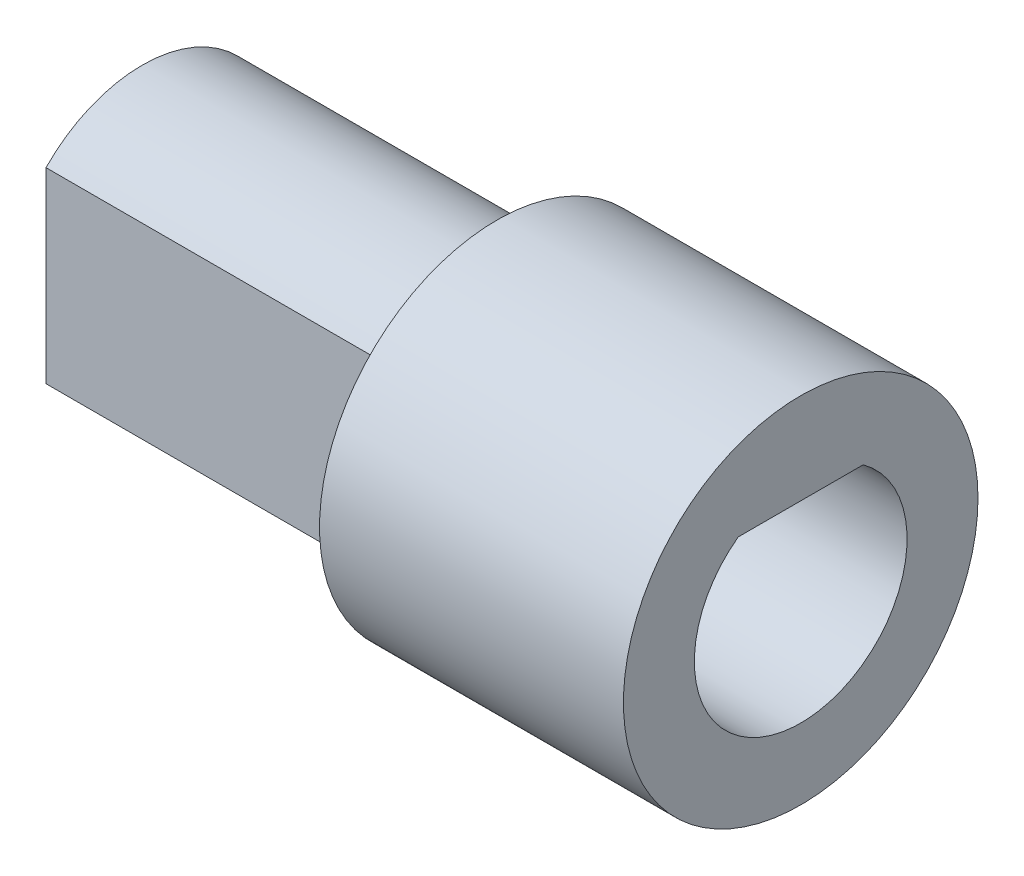
ISO-10303-21;
HEADER;
FILE_DESCRIPTION(('STEP AP214'),'2;1');
FILE_NAME('part.step','',(''),(''),'','','');
FILE_SCHEMA(('AUTOMOTIVE_DESIGN { 1 0 10303 214 1 1 1 1 }'));
ENDSEC;
DATA;
#1=APPLICATION_CONTEXT('core data for automotive mechanical design processes');
#2=APPLICATION_PROTOCOL_DEFINITION('international standard','automotive_design',2000,#1);
#3=PRODUCT_CONTEXT('',#1,'mechanical');
#4=PRODUCT('Part','Part','',(#3));
#5=PRODUCT_RELATED_PRODUCT_CATEGORY('part','',(#4));
#6=PRODUCT_DEFINITION_FORMATION('','',#4);
#7=PRODUCT_DEFINITION_CONTEXT('part definition',#1,'design');
#8=PRODUCT_DEFINITION('design','',#6,#7);
#9=PRODUCT_DEFINITION_SHAPE('','',#8);
#10=(LENGTH_UNIT() NAMED_UNIT(*) SI_UNIT(.MILLI.,.METRE.));
#11=(NAMED_UNIT(*) PLANE_ANGLE_UNIT() SI_UNIT($,.RADIAN.));
#12=(NAMED_UNIT(*) SI_UNIT($,.STERADIAN.) SOLID_ANGLE_UNIT());
#13=UNCERTAINTY_MEASURE_WITH_UNIT(LENGTH_MEASURE(1.E-05),#10,'distance_accuracy_value','');
#14=(GEOMETRIC_REPRESENTATION_CONTEXT(3) GLOBAL_UNCERTAINTY_ASSIGNED_CONTEXT((#13)) GLOBAL_UNIT_ASSIGNED_CONTEXT((#10,
#11,#12)) REPRESENTATION_CONTEXT('',''));
#15=CARTESIAN_POINT('',(0.,0.,0.));
#16=DIRECTION('',(0.,0.,1.));
#17=DIRECTION('',(1.,0.,0.));
#18=AXIS2_PLACEMENT_3D('',#15,#16,#17);
#19=CARTESIAN_POINT('',(-7.,0.,0.));
#20=DIRECTION('',(1.,0.,0.));
#21=DIRECTION('',(0.,0.,-1.));
#22=AXIS2_PLACEMENT_3D('',#19,#20,#21);
#23=CYLINDRICAL_SURFACE('',#22,2.65);
#24=DIRECTION('',(1.,0.,0.));
#25=VECTOR('',#24,1.);
#26=CARTESIAN_POINT('',(-7.,1.84729532019112,1.9));
#27=LINE('',#26,#25);
#28=CARTESIAN_POINT('',(-7.,1.84729532019112,1.9));
#29=VERTEX_POINT('',#28);
#30=CARTESIAN_POINT('',(-0.5,1.84729532019112,1.9));
#31=VERTEX_POINT('',#30);
#32=EDGE_CURVE('E143',#29,#31,#27,.T.);
#33=ORIENTED_EDGE('',*,*,#32,.T.);
#34=CARTESIAN_POINT('',(-0.5,0.,0.));
#35=DIRECTION('',(1.,0.,0.));
#36=DIRECTION('',(0.,0.,-1.));
#37=AXIS2_PLACEMENT_3D('',#34,#35,#36);
#38=CIRCLE('',#37,2.65);
#39=CARTESIAN_POINT('',(-0.5,1.84729532019112,-1.9));
#40=VERTEX_POINT('',#39);
#41=EDGE_CURVE('E11',#31,#40,#38,.F.);
#42=ORIENTED_EDGE('',*,*,#41,.T.);
#43=DIRECTION('',(1.,0.,0.));
#44=VECTOR('',#43,1.);
#45=CARTESIAN_POINT('',(-7.,1.84729532019112,-1.9));
#46=LINE('',#45,#44);
#47=CARTESIAN_POINT('',(-7.,1.84729532019112,-1.9));
#48=VERTEX_POINT('',#47);
#49=EDGE_CURVE('E144',#48,#40,#46,.T.);
#50=ORIENTED_EDGE('',*,*,#49,.F.);
#51=CARTESIAN_POINT('',(-7.,0.,0.));
#52=DIRECTION('',(1.,0.,0.));
#53=DIRECTION('',(0.,0.,-1.));
#54=AXIS2_PLACEMENT_3D('',#51,#52,#53);
#55=CIRCLE('',#54,2.65);
#56=EDGE_CURVE('E128',#48,#29,#55,.T.);
#57=ORIENTED_EDGE('',*,*,#56,.T.);
#58=EDGE_LOOP('',(#33,#42,#50,#57));
#59=FACE_BOUND('',#58,.T.);
#60=ADVANCED_FACE('F33',(#59),#23,.T.);
#61=CARTESIAN_POINT('',(-7.,1.84729532019112,-1.9));
#62=DIRECTION('',(0.,0.,-1.));
#63=DIRECTION('',(-1.,0.,0.));
#64=AXIS2_PLACEMENT_3D('',#61,#62,#63);
#65=PLANE('',#64);
#66=ORIENTED_EDGE('',*,*,#49,.T.);
#67=DIRECTION('',(0.,1.,0.));
#68=VECTOR('',#67,1.);
#69=CARTESIAN_POINT('',(-0.5,1.84729532019112,-1.9));
#70=LINE('',#69,#68);
#71=CARTESIAN_POINT('',(-0.5,-1.84729532019112,-1.9));
#72=VERTEX_POINT('',#71);
#73=EDGE_CURVE('E162',#40,#72,#70,.F.);
#74=ORIENTED_EDGE('',*,*,#73,.T.);
#75=DIRECTION('',(1.,0.,0.));
#76=VECTOR('',#75,1.);
#77=CARTESIAN_POINT('',(-7.,-1.84729532019112,-1.9));
#78=LINE('',#77,#76);
#79=CARTESIAN_POINT('',(-7.,-1.84729532019112,-1.9));
#80=VERTEX_POINT('',#79);
#81=EDGE_CURVE('E148',#80,#72,#78,.T.);
#82=ORIENTED_EDGE('',*,*,#81,.F.);
#83=DIRECTION('',(0.,1.,0.));
#84=VECTOR('',#83,1.);
#85=CARTESIAN_POINT('',(-7.,1.84729532019112,-1.9));
#86=LINE('',#85,#84);
#87=EDGE_CURVE('E140',#80,#48,#86,.T.);
#88=ORIENTED_EDGE('',*,*,#87,.T.);
#89=EDGE_LOOP('',(#66,#74,#82,#88));
#90=FACE_BOUND('',#89,.T.);
#91=ADVANCED_FACE('F211',(#90),#65,.T.);
#92=CARTESIAN_POINT('',(-7.,0.,0.));
#93=DIRECTION('',(1.,0.,0.));
#94=DIRECTION('',(0.,0.,-1.));
#95=AXIS2_PLACEMENT_3D('',#92,#93,#94);
#96=CYLINDRICAL_SURFACE('',#95,2.65);
#97=ORIENTED_EDGE('',*,*,#81,.T.);
#98=CARTESIAN_POINT('',(-0.5,0.,0.));
#99=DIRECTION('',(1.,0.,0.));
#100=DIRECTION('',(0.,0.,-1.));
#101=AXIS2_PLACEMENT_3D('',#98,#99,#100);
#102=CIRCLE('',#101,2.65);
#103=CARTESIAN_POINT('',(-0.5,-1.84729532019112,1.9));
#104=VERTEX_POINT('',#103);
#105=EDGE_CURVE('E165',#72,#104,#102,.F.);
#106=ORIENTED_EDGE('',*,*,#105,.T.);
#107=DIRECTION('',(1.,0.,0.));
#108=VECTOR('',#107,1.);
#109=CARTESIAN_POINT('',(-7.,-1.84729532019112,1.9));
#110=LINE('',#109,#108);
#111=CARTESIAN_POINT('',(-7.,-1.84729532019112,1.9));
#112=VERTEX_POINT('',#111);
#113=EDGE_CURVE('E151',#112,#104,#110,.T.);
#114=ORIENTED_EDGE('',*,*,#113,.F.);
#115=CARTESIAN_POINT('',(-7.,0.,0.));
#116=DIRECTION('',(1.,0.,0.));
#117=DIRECTION('',(0.,0.,-1.));
#118=AXIS2_PLACEMENT_3D('',#115,#116,#117);
#119=CIRCLE('',#118,2.65);
#120=EDGE_CURVE('E137',#112,#80,#119,.T.);
#121=ORIENTED_EDGE('',*,*,#120,.T.);
#122=EDGE_LOOP('',(#97,#106,#114,#121));
#123=FACE_BOUND('',#122,.T.);
#124=ADVANCED_FACE('F212',(#123),#96,.T.);
#125=CARTESIAN_POINT('',(-7.,1.84729532019112,1.9));
#126=DIRECTION('',(0.,0.,1.));
#127=DIRECTION('',(1.,0.,0.));
#128=AXIS2_PLACEMENT_3D('',#125,#126,#127);
#129=PLANE('',#128);
#130=ORIENTED_EDGE('',*,*,#113,.T.);
#131=DIRECTION('',(0.,-1.,0.));
#132=VECTOR('',#131,1.);
#133=CARTESIAN_POINT('',(-0.5,1.84729532019112,1.9));
#134=LINE('',#133,#132);
#135=EDGE_CURVE('E47',#104,#31,#134,.F.);
#136=ORIENTED_EDGE('',*,*,#135,.T.);
#137=ORIENTED_EDGE('',*,*,#32,.F.);
#138=DIRECTION('',(0.,-1.,0.));
#139=VECTOR('',#138,1.);
#140=CARTESIAN_POINT('',(-7.,1.84729532019112,1.9));
#141=LINE('',#140,#139);
#142=EDGE_CURVE('E134',#29,#112,#141,.T.);
#143=ORIENTED_EDGE('',*,*,#142,.T.);
#144=EDGE_LOOP('',(#130,#136,#137,#143));
#145=FACE_BOUND('',#144,.T.);
#146=ADVANCED_FACE('F240',(#145),#129,.T.);
#147=CARTESIAN_POINT('',(-7.,0.,0.));
#148=DIRECTION('',(1.,0.,0.));
#149=DIRECTION('',(0.,0.,-1.));
#150=AXIS2_PLACEMENT_3D('',#147,#148,#149);
#151=PLANE('',#150);
#152=ORIENTED_EDGE('',*,*,#56,.F.);
#153=ORIENTED_EDGE('',*,*,#87,.F.);
#154=ORIENTED_EDGE('',*,*,#120,.F.);
#155=ORIENTED_EDGE('',*,*,#142,.F.);
#156=EDGE_LOOP('',(#152,#153,#154,#155));
#157=FACE_BOUND('',#156,.T.);
#158=ADVANCED_FACE('F218',(#157),#151,.F.);
#159=CARTESIAN_POINT('',(0.,0.,0.));
#160=DIRECTION('',(1.,0.,0.));
#161=DIRECTION('',(0.,0.,-1.));
#162=AXIS2_PLACEMENT_3D('',#159,#160,#161);
#163=PLANE('',#162);
#164=CARTESIAN_POINT('',(0.,0.,0.));
#165=DIRECTION('',(1.,0.,0.));
#166=DIRECTION('',(0.,0.,-1.));
#167=AXIS2_PLACEMENT_3D('',#164,#165,#166);
#168=CIRCLE('',#167,3.15);
#169=CARTESIAN_POINT('',(0.,-2.04022057631032,2.4));
#170=VERTEX_POINT('',#169);
#171=CARTESIAN_POINT('',(0.,-2.04022057631032,-2.4));
#172=VERTEX_POINT('',#171);
#173=EDGE_CURVE('E157',#170,#172,#168,.T.);
#174=ORIENTED_EDGE('',*,*,#173,.T.);
#175=DIRECTION('',(0.,1.,0.));
#176=VECTOR('',#175,1.);
#177=CARTESIAN_POINT('',(0.,0.,-2.4));
#178=LINE('',#177,#176);
#179=CARTESIAN_POINT('',(0.,2.04022057631032,-2.4));
#180=VERTEX_POINT('',#179);
#181=EDGE_CURVE('E159',#172,#180,#178,.T.);
#182=ORIENTED_EDGE('',*,*,#181,.T.);
#183=CARTESIAN_POINT('',(0.,0.,0.));
#184=DIRECTION('',(1.,0.,0.));
#185=DIRECTION('',(0.,0.,-1.));
#186=AXIS2_PLACEMENT_3D('',#183,#184,#185);
#187=CIRCLE('',#186,3.15);
#188=CARTESIAN_POINT('',(0.,2.04022057631032,2.4));
#189=VERTEX_POINT('',#188);
#190=EDGE_CURVE('E147',#180,#189,#187,.T.);
#191=ORIENTED_EDGE('',*,*,#190,.T.);
#192=DIRECTION('',(0.,-1.,0.));
#193=VECTOR('',#192,1.);
#194=CARTESIAN_POINT('',(0.,0.,2.4));
#195=LINE('',#194,#193);
#196=EDGE_CURVE('E155',#189,#170,#195,.T.);
#197=ORIENTED_EDGE('',*,*,#196,.T.);
#198=EDGE_LOOP('',(#174,#182,#191,#197));
#199=FACE_BOUND('',#198,.T.);
#200=CARTESIAN_POINT('',(0.,0.,0.));
#201=DIRECTION('',(1.,0.,0.));
#202=DIRECTION('',(0.,0.,-1.));
#203=AXIS2_PLACEMENT_3D('',#200,#201,#202);
#204=CIRCLE('',#203,3.5);
#205=CARTESIAN_POINT('',(0.,0.,-3.5));
#206=VERTEX_POINT('',#205);
#207=EDGE_CURVE('E129',#206,#206,#204,.T.);
#208=ORIENTED_EDGE('',*,*,#207,.F.);
#209=EDGE_LOOP('',(#208));
#210=FACE_BOUND('',#209,.T.);
#211=ADVANCED_FACE('F222',(#199,#210),#163,.F.);
#212=CARTESIAN_POINT('',(6.,0.,0.));
#213=DIRECTION('',(-1.,0.,0.));
#214=DIRECTION('',(0.,0.,1.));
#215=AXIS2_PLACEMENT_3D('',#212,#213,#214);
#216=CYLINDRICAL_SURFACE('',#215,3.5);
#217=CARTESIAN_POINT('',(6.,0.,0.));
#218=DIRECTION('',(1.,0.,0.));
#219=DIRECTION('',(0.,0.,-1.));
#220=AXIS2_PLACEMENT_3D('',#217,#218,#219);
#221=CIRCLE('',#220,3.5);
#222=CARTESIAN_POINT('',(6.,0.,-3.5));
#223=VERTEX_POINT('',#222);
#224=EDGE_CURVE('E125',#223,#223,#221,.T.);
#225=ORIENTED_EDGE('',*,*,#224,.F.);
#226=EDGE_LOOP('',(#225));
#227=FACE_BOUND('',#226,.T.);
#228=ORIENTED_EDGE('',*,*,#207,.T.);
#229=EDGE_LOOP('',(#228));
#230=FACE_BOUND('',#229,.T.);
#231=ADVANCED_FACE('F231',(#227,#230),#216,.T.);
#232=CARTESIAN_POINT('',(6.,0.,0.));
#233=DIRECTION('',(1.,0.,0.));
#234=DIRECTION('',(0.,0.,-1.));
#235=AXIS2_PLACEMENT_3D('',#232,#233,#234);
#236=PLANE('',#235);
#237=CARTESIAN_POINT('',(6.,0.,0.));
#238=DIRECTION('',(1.,0.,0.));
#239=DIRECTION('',(0.,0.,-1.));
#240=AXIS2_PLACEMENT_3D('',#237,#238,#239);
#241=CIRCLE('',#240,2.1);
#242=CARTESIAN_POINT('',(6.,1.7,1.2328828005938));
#243=VERTEX_POINT('',#242);
#244=CARTESIAN_POINT('',(6.,1.7,-1.2328828005938));
#245=VERTEX_POINT('',#244);
#246=EDGE_CURVE('E55',#243,#245,#241,.T.);
#247=ORIENTED_EDGE('',*,*,#246,.F.);
#248=DIRECTION('',(0.,0.,1.));
#249=VECTOR('',#248,1.);
#250=CARTESIAN_POINT('',(6.,1.7,1.2328828005938));
#251=LINE('',#250,#249);
#252=EDGE_CURVE('E116',#245,#243,#251,.T.);
#253=ORIENTED_EDGE('',*,*,#252,.F.);
#254=EDGE_LOOP('',(#247,#253));
#255=FACE_BOUND('',#254,.T.);
#256=ORIENTED_EDGE('',*,*,#224,.T.);
#257=EDGE_LOOP('',(#256));
#258=FACE_BOUND('',#257,.T.);
#259=ADVANCED_FACE('F226',(#255,#258),#236,.T.);
#260=CARTESIAN_POINT('',(-0.5,0.,2.4));
#261=DIRECTION('',(0.,-1.,0.));
#262=DIRECTION('',(0.,0.,-1.));
#263=AXIS2_PLACEMENT_3D('',#260,#261,#262);
#264=CYLINDRICAL_SURFACE('',#263,0.5);
#265=CARTESIAN_POINT('',(-0.5,1.84729532019112,1.9));
#266=CARTESIAN_POINT('',(-0.473313299022205,1.84728099192078,1.89997037218295));
#267=CARTESIAN_POINT('',(-0.446646865629517,1.84816191215664,1.9021344661516));
#268=CARTESIAN_POINT('',(-0.394169339908651,1.85160200274379,1.91061654198202));
#269=CARTESIAN_POINT('',(-0.36835602889857,1.85415638877057,1.91692268214877));
#270=CARTESIAN_POINT('',(-0.318246984437916,1.86083128190166,1.93345511544516));
#271=CARTESIAN_POINT('',(-0.293950783441736,1.86495130370436,1.9436801938262));
#272=CARTESIAN_POINT('',(-0.247467436875275,1.8745731808725,1.96766759561641));
#273=CARTESIAN_POINT('',(-0.225281143808752,1.8800755915466,1.98143134056773));
#274=CARTESIAN_POINT('',(-0.182846848627034,1.89244383561732,2.01253625988208));
#275=CARTESIAN_POINT('',(-0.162683884474139,1.89934775247858,2.02997805365335));
#276=CARTESIAN_POINT('',(-0.125542800850984,1.91415093797732,2.06761270037761));
#277=CARTESIAN_POINT('',(-0.108565794348544,1.92205055284239,2.08780651047061));
#278=CARTESIAN_POINT('',(-0.0770523696468303,1.93916734983726,2.13186128372807));
#279=CARTESIAN_POINT('',(-0.0627640663230558,1.94843778064198,2.1558789315621));
#280=CARTESIAN_POINT('',(-0.0384323189516263,1.96754809981078,2.2057695404265));
#281=CARTESIAN_POINT('',(-0.0283895659525638,1.97738808058444,2.23164280269435));
#282=CARTESIAN_POINT('',(-0.0139796544551096,1.99576003930094,2.28032503712598));
#283=CARTESIAN_POINT('',(-0.00896115666311815,2.00424914064896,2.30296122192505));
#284=CARTESIAN_POINT('',(-0.00210851708425217,2.02127667251313,2.34865813525806));
#285=CARTESIAN_POINT('',(-0.000268088516354063,2.02981497203937,2.37171793422004));
#286=CARTESIAN_POINT('',(-9.04590209242298E-06,2.03894214138096,2.39652309187162));
#287=CARTESIAN_POINT('',(2.34085730246771E-08,2.03958152104385,2.39826157490041));
#288=CARTESIAN_POINT('',(0.,2.04022057631032,2.4));
#289=B_SPLINE_CURVE_WITH_KNOTS('',3,(#265,#266,#267,#268,#269,#270,#271,#272,#273,#274,#275,
#276,#277,#278,#279,#280,#281,#282,#283,#284,#285,#286,#287,#288),.UNSPECIFIED.,.F.,.F.,(4,2,2,
2,2,2,2,2,2,2,2,4),(0.,0.0799265424749896,0.159625571774669,0.239299916814884,0.319006318532275,
0.401270296432231,0.483562958773993,0.571514646980536,0.65948064558405,0.733359977388135,
0.807092994714623,0.812649950240695),.UNSPECIFIED.);
#290=EDGE_CURVE('E190',#31,#189,#289,.T.);
#291=ORIENTED_EDGE('',*,*,#290,.F.);
#292=ORIENTED_EDGE('',*,*,#135,.F.);
#293=CARTESIAN_POINT('',(-0.5,-1.84729532019112,1.9));
#294=CARTESIAN_POINT('',(-0.473313299022205,-1.84728099192078,1.89997037218295));
#295=CARTESIAN_POINT('',(-0.446646865629517,-1.84816191215664,1.9021344661516));
#296=CARTESIAN_POINT('',(-0.394169339908651,-1.85160200274379,1.91061654198202));
#297=CARTESIAN_POINT('',(-0.36835602889857,-1.85415638877057,1.91692268214877));
#298=CARTESIAN_POINT('',(-0.318246984437916,-1.86083128190166,1.93345511544516));
#299=CARTESIAN_POINT('',(-0.293950783441736,-1.86495130370436,1.9436801938262));
#300=CARTESIAN_POINT('',(-0.247467436875275,-1.8745731808725,1.96766759561641));
#301=CARTESIAN_POINT('',(-0.225281143808752,-1.8800755915466,1.98143134056773));
#302=CARTESIAN_POINT('',(-0.182846848627034,-1.89244383561732,2.01253625988208));
#303=CARTESIAN_POINT('',(-0.162683884474139,-1.89934775247858,2.02997805365335));
#304=CARTESIAN_POINT('',(-0.125542800850984,-1.91415093797732,2.06761270037761));
#305=CARTESIAN_POINT('',(-0.108565794348544,-1.92205055284239,2.08780651047061));
#306=CARTESIAN_POINT('',(-0.0770523696468303,-1.93916734983726,2.13186128372807));
#307=CARTESIAN_POINT('',(-0.0627640663230558,-1.94843778064198,2.1558789315621));
#308=CARTESIAN_POINT('',(-0.0384323189516263,-1.96754809981078,2.2057695404265));
#309=CARTESIAN_POINT('',(-0.0283895659525638,-1.97738808058444,2.23164280269435));
#310=CARTESIAN_POINT('',(-0.0139796544551096,-1.99576003930094,2.28032503712598));
#311=CARTESIAN_POINT('',(-0.00896115666311815,-2.00424914064896,2.30296122192505));
#312=CARTESIAN_POINT('',(-0.00210851708425217,-2.02127667251313,2.34865813525806));
#313=CARTESIAN_POINT('',(-0.000268088516354063,-2.02981497203937,2.37171793422004));
#314=CARTESIAN_POINT('',(-9.04590209242298E-06,-2.03894214138096,2.39652309187162));
#315=CARTESIAN_POINT('',(2.34085730246771E-08,-2.03958152104385,2.39826157490041));
#316=CARTESIAN_POINT('',(0.,-2.04022057631032,2.4));
#317=B_SPLINE_CURVE_WITH_KNOTS('',3,(#293,#294,#295,#296,#297,#298,#299,#300,#301,#302,#303,
#304,#305,#306,#307,#308,#309,#310,#311,#312,#313,#314,#315,#316),.UNSPECIFIED.,.F.,.F.,(4,2,2,
2,2,2,2,2,2,2,2,4),(0.,0.0799265424749896,0.159625571774669,0.239299916814884,0.319006318532275,
0.401270296432231,0.483562958773993,0.571514646980536,0.65948064558405,0.733359977388135,
0.807092994714623,0.812649950240695),.UNSPECIFIED.);
#318=EDGE_CURVE('E38',#170,#104,#317,.F.);
#319=ORIENTED_EDGE('',*,*,#318,.F.);
#320=ORIENTED_EDGE('',*,*,#196,.F.);
#321=EDGE_LOOP('',(#291,#292,#319,#320));
#322=FACE_BOUND('',#321,.T.);
#323=ADVANCED_FACE('F35',(#322),#264,.F.);
#324=CARTESIAN_POINT('',(-0.5,0.,0.));
#325=DIRECTION('',(1.,0.,0.));
#326=DIRECTION('',(0.,0.,-1.));
#327=AXIS2_PLACEMENT_3D('',#324,#325,#326);
#328=TOROIDAL_SURFACE('',#327,3.15,0.5);
#329=ORIENTED_EDGE('',*,*,#318,.T.);
#330=ORIENTED_EDGE('',*,*,#105,.F.);
#331=CARTESIAN_POINT('',(-0.5,-1.84729532019112,-1.9));
#332=CARTESIAN_POINT('',(-0.473313299022205,-1.84728099192078,-1.89997037218295));
#333=CARTESIAN_POINT('',(-0.446646865629517,-1.84816191215664,-1.9021344661516));
#334=CARTESIAN_POINT('',(-0.394169339908652,-1.85160200274379,-1.91061654198202));
#335=CARTESIAN_POINT('',(-0.36835602889857,-1.85415638877057,-1.91692268214877));
#336=CARTESIAN_POINT('',(-0.318246984437916,-1.86083128190166,-1.93345511544516));
#337=CARTESIAN_POINT('',(-0.293950783441736,-1.86495130370436,-1.9436801938262));
#338=CARTESIAN_POINT('',(-0.247467436875275,-1.8745731808725,-1.96766759561641));
#339=CARTESIAN_POINT('',(-0.225281143808752,-1.8800755915466,-1.98143134056773));
#340=CARTESIAN_POINT('',(-0.182846848627034,-1.89244383561732,-2.01253625988208));
#341=CARTESIAN_POINT('',(-0.162683884474139,-1.89934775247858,-2.02997805365335));
#342=CARTESIAN_POINT('',(-0.125542800850984,-1.91415093797732,-2.06761270037761));
#343=CARTESIAN_POINT('',(-0.108565794348544,-1.92205055284239,-2.08780651047061));
#344=CARTESIAN_POINT('',(-0.0770523696468304,-1.93916734983726,-2.13186128372807));
#345=CARTESIAN_POINT('',(-0.0627640663230558,-1.94843778064198,-2.1558789315621));
#346=CARTESIAN_POINT('',(-0.0384323189516262,-1.96754809981078,-2.2057695404265));
#347=CARTESIAN_POINT('',(-0.0283895659525637,-1.97738808058444,-2.23164280269435));
#348=CARTESIAN_POINT('',(-0.0139796544551096,-1.99576003930094,-2.28032503712598));
#349=CARTESIAN_POINT('',(-0.00896115666311833,-2.00424914064896,-2.30296122192505));
#350=CARTESIAN_POINT('',(-0.00210851708425226,-2.02127667251313,-2.34865813525805));
#351=CARTESIAN_POINT('',(-0.000268088516354005,-2.02981497203937,-2.37171793422004));
#352=CARTESIAN_POINT('',(-9.04590209241384E-06,-2.03894214138096,-2.39652309187162));
#353=CARTESIAN_POINT('',(2.34085730293216E-08,-2.03958152104385,-2.39826157490041));
#354=CARTESIAN_POINT('',(0.,-2.04022057631032,-2.4));
#355=B_SPLINE_CURVE_WITH_KNOTS('',3,(#331,#332,#333,#334,#335,#336,#337,#338,#339,#340,#341,
#342,#343,#344,#345,#346,#347,#348,#349,#350,#351,#352,#353,#354),.UNSPECIFIED.,.F.,.F.,(4,2,2,
2,2,2,2,2,2,2,2,4),(0.,0.0799265424749896,0.159625571774669,0.239299916814884,0.319006318532275,
0.401270296432231,0.483562958773993,0.571514646980536,0.65948064558405,0.733359977388134,
0.807092994714622,0.812649950240695),.UNSPECIFIED.);
#356=EDGE_CURVE('E175',#172,#72,#355,.F.);
#357=ORIENTED_EDGE('',*,*,#356,.F.);
#358=ORIENTED_EDGE('',*,*,#173,.F.);
#359=EDGE_LOOP('',(#329,#330,#357,#358));
#360=FACE_BOUND('',#359,.T.);
#361=ADVANCED_FACE('F186',(#360),#328,.F.);
#362=CARTESIAN_POINT('',(-0.5,0.,0.));
#363=DIRECTION('',(1.,0.,0.));
#364=DIRECTION('',(0.,0.,-1.));
#365=AXIS2_PLACEMENT_3D('',#362,#363,#364);
#366=TOROIDAL_SURFACE('',#365,3.15,0.5);
#367=ORIENTED_EDGE('',*,*,#290,.T.);
#368=ORIENTED_EDGE('',*,*,#190,.F.);
#369=CARTESIAN_POINT('',(-0.5,1.84729532019112,-1.9));
#370=CARTESIAN_POINT('',(-0.473313299022205,1.84728099192078,-1.89997037218295));
#371=CARTESIAN_POINT('',(-0.446646865629517,1.84816191215664,-1.9021344661516));
#372=CARTESIAN_POINT('',(-0.394169339908652,1.85160200274379,-1.91061654198202));
#373=CARTESIAN_POINT('',(-0.36835602889857,1.85415638877057,-1.91692268214877));
#374=CARTESIAN_POINT('',(-0.318246984437916,1.86083128190166,-1.93345511544516));
#375=CARTESIAN_POINT('',(-0.293950783441736,1.86495130370436,-1.9436801938262));
#376=CARTESIAN_POINT('',(-0.247467436875275,1.8745731808725,-1.96766759561641));
#377=CARTESIAN_POINT('',(-0.225281143808752,1.8800755915466,-1.98143134056773));
#378=CARTESIAN_POINT('',(-0.182846848627034,1.89244383561732,-2.01253625988208));
#379=CARTESIAN_POINT('',(-0.162683884474139,1.89934775247857,-2.02997805365335));
#380=CARTESIAN_POINT('',(-0.125542800850984,1.91415093797732,-2.06761270037761));
#381=CARTESIAN_POINT('',(-0.108565794348544,1.92205055284239,-2.08780651047061));
#382=CARTESIAN_POINT('',(-0.0770523696468304,1.93916734983726,-2.13186128372807));
#383=CARTESIAN_POINT('',(-0.0627640663230558,1.94843778064198,-2.1558789315621));
#384=CARTESIAN_POINT('',(-0.0384323189516262,1.96754809981078,-2.2057695404265));
#385=CARTESIAN_POINT('',(-0.0283895659525637,1.97738808058444,-2.23164280269435));
#386=CARTESIAN_POINT('',(-0.0139796544551096,1.99576003930094,-2.28032503712598));
#387=CARTESIAN_POINT('',(-0.00896115666311825,2.00424914064896,-2.30296122192505));
#388=CARTESIAN_POINT('',(-0.00210851708425228,2.02127667251313,-2.34865813525805));
#389=CARTESIAN_POINT('',(-0.000268088516354151,2.02981497203937,-2.37171793422004));
#390=CARTESIAN_POINT('',(-9.04590209243509E-06,2.03894214138096,-2.39652309187162));
#391=CARTESIAN_POINT('',(2.34085730181934E-08,2.03958152104385,-2.39826157490041));
#392=CARTESIAN_POINT('',(0.,2.04022057631032,-2.4));
#393=B_SPLINE_CURVE_WITH_KNOTS('',3,(#369,#370,#371,#372,#373,#374,#375,#376,#377,#378,#379,
#380,#381,#382,#383,#384,#385,#386,#387,#388,#389,#390,#391,#392),.UNSPECIFIED.,.F.,.F.,(4,2,2,
2,2,2,2,2,2,2,2,4),(0.,0.0799265424749895,0.159625571774669,0.239299916814884,0.319006318532275,
0.401270296432231,0.483562958773993,0.571514646980536,0.65948064558405,0.733359977388134,
0.807092994714622,0.812649950240695),.UNSPECIFIED.);
#394=EDGE_CURVE('E123',#40,#180,#393,.T.);
#395=ORIENTED_EDGE('',*,*,#394,.F.);
#396=ORIENTED_EDGE('',*,*,#41,.F.);
#397=EDGE_LOOP('',(#367,#368,#395,#396));
#398=FACE_BOUND('',#397,.T.);
#399=ADVANCED_FACE('F183',(#398),#366,.F.);
#400=CARTESIAN_POINT('',(-0.5,0.,-2.4));
#401=DIRECTION('',(0.,1.,0.));
#402=DIRECTION('',(0.,0.,1.));
#403=AXIS2_PLACEMENT_3D('',#400,#401,#402);
#404=CYLINDRICAL_SURFACE('',#403,0.5);
#405=ORIENTED_EDGE('',*,*,#356,.T.);
#406=ORIENTED_EDGE('',*,*,#73,.F.);
#407=ORIENTED_EDGE('',*,*,#394,.T.);
#408=ORIENTED_EDGE('',*,*,#181,.F.);
#409=EDGE_LOOP('',(#405,#406,#407,#408));
#410=FACE_BOUND('',#409,.T.);
#411=ADVANCED_FACE('F180',(#410),#404,.F.);
#412=CARTESIAN_POINT('',(1.,0.,0.));
#413=DIRECTION('',(1.,0.,0.));
#414=DIRECTION('',(0.,0.,-1.));
#415=AXIS2_PLACEMENT_3D('',#412,#413,#414);
#416=CYLINDRICAL_SURFACE('',#415,2.1);
#417=ORIENTED_EDGE('',*,*,#246,.T.);
#418=DIRECTION('',(1.,0.,0.));
#419=VECTOR('',#418,1.);
#420=CARTESIAN_POINT('',(1.,1.7,-1.2328828005938));
#421=LINE('',#420,#419);
#422=CARTESIAN_POINT('',(1.,1.7,-1.2328828005938));
#423=VERTEX_POINT('',#422);
#424=EDGE_CURVE('E102',#423,#245,#421,.T.);
#425=ORIENTED_EDGE('',*,*,#424,.F.);
#426=CARTESIAN_POINT('',(1.,0.,0.));
#427=DIRECTION('',(1.,0.,0.));
#428=DIRECTION('',(0.,0.,-1.));
#429=AXIS2_PLACEMENT_3D('',#426,#427,#428);
#430=CIRCLE('',#429,2.1);
#431=CARTESIAN_POINT('',(1.,1.7,1.2328828005938));
#432=VERTEX_POINT('',#431);
#433=EDGE_CURVE('E105',#432,#423,#430,.T.);
#434=ORIENTED_EDGE('',*,*,#433,.F.);
#435=DIRECTION('',(1.,0.,0.));
#436=VECTOR('',#435,1.);
#437=CARTESIAN_POINT('',(1.,1.7,1.2328828005938));
#438=LINE('',#437,#436);
#439=EDGE_CURVE('E111',#432,#243,#438,.T.);
#440=ORIENTED_EDGE('',*,*,#439,.T.);
#441=EDGE_LOOP('',(#417,#425,#434,#440));
#442=FACE_BOUND('',#441,.T.);
#443=ADVANCED_FACE('F104',(#442),#416,.F.);
#444=CARTESIAN_POINT('',(1.,1.7,1.2328828005938));
#445=DIRECTION('',(0.,1.,0.));
#446=DIRECTION('',(0.,0.,1.));
#447=AXIS2_PLACEMENT_3D('',#444,#445,#446);
#448=PLANE('',#447);
#449=ORIENTED_EDGE('',*,*,#252,.T.);
#450=ORIENTED_EDGE('',*,*,#439,.F.);
#451=DIRECTION('',(0.,0.,1.));
#452=VECTOR('',#451,1.);
#453=CARTESIAN_POINT('',(1.,1.7,1.2328828005938));
#454=LINE('',#453,#452);
#455=EDGE_CURVE('E112',#423,#432,#454,.T.);
#456=ORIENTED_EDGE('',*,*,#455,.F.);
#457=ORIENTED_EDGE('',*,*,#424,.T.);
#458=EDGE_LOOP('',(#449,#450,#456,#457));
#459=FACE_BOUND('',#458,.T.);
#460=ADVANCED_FACE('F118',(#459),#448,.F.);
#461=CARTESIAN_POINT('',(1.,0.,0.));
#462=DIRECTION('',(1.,0.,0.));
#463=DIRECTION('',(0.,0.,-1.));
#464=AXIS2_PLACEMENT_3D('',#461,#462,#463);
#465=PLANE('',#464);
#466=ORIENTED_EDGE('',*,*,#433,.T.);
#467=ORIENTED_EDGE('',*,*,#455,.T.);
#468=EDGE_LOOP('',(#466,#467));
#469=FACE_BOUND('',#468,.T.);
#470=ADVANCED_FACE('F115',(#469),#465,.T.);
#471=CLOSED_SHELL('',(#60,#91,#124,#146,#158,#211,#231,#259,#323,#361,#399,#411,#443,#460,#470));
#472=MANIFOLD_SOLID_BREP('B2',#471);
#473=ADVANCED_BREP_SHAPE_REPRESENTATION('',(#18,#472),#14);
#474=SHAPE_DEFINITION_REPRESENTATION(#9,#473);
ENDSEC;
END-ISO-10303-21;
